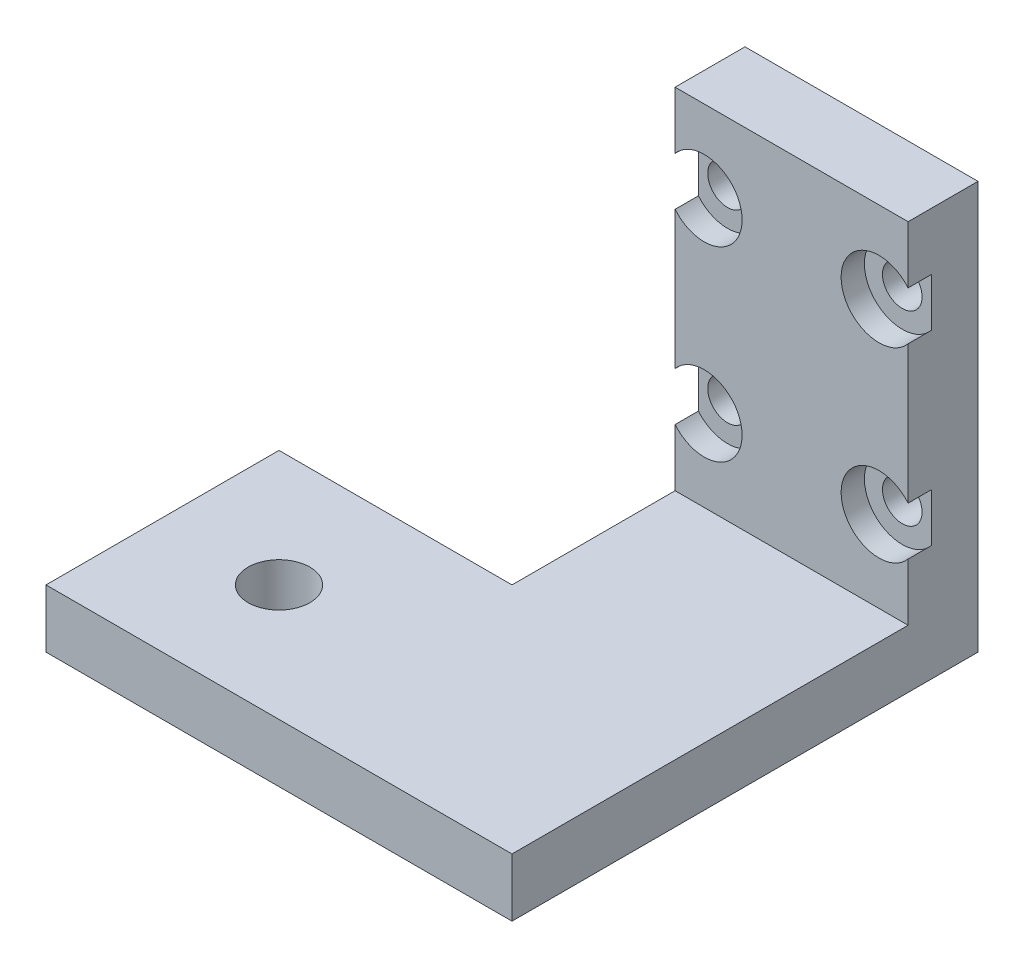
ISO-10303-21;
HEADER;
FILE_DESCRIPTION(('STEP AP214'),'2;1');
FILE_NAME('part.step','',(''),(''),'','','');
FILE_SCHEMA(('AUTOMOTIVE_DESIGN { 1 0 10303 214 1 1 1 1 }'));
ENDSEC;
DATA;
#1=APPLICATION_CONTEXT('core data for automotive mechanical design processes');
#2=APPLICATION_PROTOCOL_DEFINITION('international standard','automotive_design',2000,#1);
#3=PRODUCT_CONTEXT('',#1,'mechanical');
#4=PRODUCT('Part','Part','',(#3));
#5=PRODUCT_RELATED_PRODUCT_CATEGORY('part','',(#4));
#6=PRODUCT_DEFINITION_FORMATION('','',#4);
#7=PRODUCT_DEFINITION_CONTEXT('part definition',#1,'design');
#8=PRODUCT_DEFINITION('design','',#6,#7);
#9=PRODUCT_DEFINITION_SHAPE('','',#8);
#10=(LENGTH_UNIT() NAMED_UNIT(*) SI_UNIT(.MILLI.,.METRE.));
#11=(NAMED_UNIT(*) PLANE_ANGLE_UNIT() SI_UNIT($,.RADIAN.));
#12=(NAMED_UNIT(*) SI_UNIT($,.STERADIAN.) SOLID_ANGLE_UNIT());
#13=UNCERTAINTY_MEASURE_WITH_UNIT(LENGTH_MEASURE(1.E-05),#10,'distance_accuracy_value','');
#14=(GEOMETRIC_REPRESENTATION_CONTEXT(3) GLOBAL_UNCERTAINTY_ASSIGNED_CONTEXT((#13)) GLOBAL_UNIT_ASSIGNED_CONTEXT((#10,
#11,#12)) REPRESENTATION_CONTEXT('',''));
#15=CARTESIAN_POINT('',(0.,0.,0.));
#16=DIRECTION('',(0.,0.,1.));
#17=DIRECTION('',(1.,0.,0.));
#18=AXIS2_PLACEMENT_3D('',#15,#16,#17);
#19=CARTESIAN_POINT('',(0.,-5.,0.));
#20=DIRECTION('',(0.,1.,0.));
#21=DIRECTION('',(0.,0.,1.));
#22=AXIS2_PLACEMENT_3D('',#19,#20,#21);
#23=PLANE('',#22);
#24=DIRECTION('',(0.,0.,1.));
#25=VECTOR('',#24,1.);
#26=CARTESIAN_POINT('',(0.,-5.,0.));
#27=LINE('',#26,#25);
#28=CARTESIAN_POINT('',(0.,-5.,-20.));
#29=VERTEX_POINT('',#28);
#30=CARTESIAN_POINT('',(0.,-5.,0.));
#31=VERTEX_POINT('',#30);
#32=EDGE_CURVE('E178',#29,#31,#27,.T.);
#33=ORIENTED_EDGE('',*,*,#32,.F.);
#34=DIRECTION('',(-1.,0.,0.));
#35=VECTOR('',#34,1.);
#36=CARTESIAN_POINT('',(20.,-5.,-20.));
#37=LINE('',#36,#35);
#38=CARTESIAN_POINT('',(20.,-5.,-20.));
#39=VERTEX_POINT('',#38);
#40=EDGE_CURVE('E192',#39,#29,#37,.T.);
#41=ORIENTED_EDGE('',*,*,#40,.F.);
#42=DIRECTION('',(0.,0.,-1.));
#43=VECTOR('',#42,1.);
#44=CARTESIAN_POINT('',(20.,-5.,0.));
#45=LINE('',#44,#43);
#46=CARTESIAN_POINT('',(20.,-5.,20.));
#47=VERTEX_POINT('',#46);
#48=EDGE_CURVE('E190',#47,#39,#45,.T.);
#49=ORIENTED_EDGE('',*,*,#48,.F.);
#50=DIRECTION('',(1.,0.,0.));
#51=VECTOR('',#50,1.);
#52=CARTESIAN_POINT('',(0.,-5.,20.));
#53=LINE('',#52,#51);
#54=CARTESIAN_POINT('',(-20.,-5.,20.));
#55=VERTEX_POINT('',#54);
#56=EDGE_CURVE('E188',#55,#47,#53,.T.);
#57=ORIENTED_EDGE('',*,*,#56,.F.);
#58=DIRECTION('',(0.,0.,1.));
#59=VECTOR('',#58,1.);
#60=CARTESIAN_POINT('',(-20.,-5.,0.));
#61=LINE('',#60,#59);
#62=CARTESIAN_POINT('',(-20.,-5.,0.));
#63=VERTEX_POINT('',#62);
#64=EDGE_CURVE('E185',#63,#55,#61,.T.);
#65=ORIENTED_EDGE('',*,*,#64,.F.);
#66=DIRECTION('',(-1.,0.,0.));
#67=VECTOR('',#66,1.);
#68=CARTESIAN_POINT('',(0.,-5.,0.));
#69=LINE('',#68,#67);
#70=EDGE_CURVE('E181',#31,#63,#69,.T.);
#71=ORIENTED_EDGE('',*,*,#70,.F.);
#72=EDGE_LOOP('',(#33,#41,#49,#57,#65,#71));
#73=FACE_BOUND('',#72,.T.);
#74=CARTESIAN_POINT('',(-10.,-5.,10.));
#75=DIRECTION('',(0.,-1.,0.));
#76=DIRECTION('',(0.,0.,-1.));
#77=AXIS2_PLACEMENT_3D('',#74,#75,#76);
#78=CIRCLE('',#77,2.64999999999999);
#79=CARTESIAN_POINT('',(-10.,-5.,7.35000000000001));
#80=VERTEX_POINT('',#79);
#81=EDGE_CURVE('E303',#80,#80,#78,.T.);
#82=ORIENTED_EDGE('',*,*,#81,.F.);
#83=EDGE_LOOP('',(#82));
#84=FACE_BOUND('',#83,.T.);
#85=ADVANCED_FACE('F37',(#73,#84),#23,.F.);
#86=CARTESIAN_POINT('',(0.,0.,0.));
#87=DIRECTION('',(0.,1.,0.));
#88=DIRECTION('',(0.,0.,1.));
#89=AXIS2_PLACEMENT_3D('',#86,#87,#88);
#90=PLANE('',#89);
#91=DIRECTION('',(1.,0.,0.));
#92=VECTOR('',#91,1.);
#93=CARTESIAN_POINT('',(20.,0.,-14.));
#94=LINE('',#93,#92);
#95=CARTESIAN_POINT('',(0.,0.,-14.));
#96=VERTEX_POINT('',#95);
#97=CARTESIAN_POINT('',(20.,0.,-14.));
#98=VERTEX_POINT('',#97);
#99=EDGE_CURVE('E248',#96,#98,#94,.T.);
#100=ORIENTED_EDGE('',*,*,#99,.F.);
#101=DIRECTION('',(0.,0.,1.));
#102=VECTOR('',#101,1.);
#103=CARTESIAN_POINT('',(0.,0.,0.));
#104=LINE('',#103,#102);
#105=CARTESIAN_POINT('',(0.,0.,0.));
#106=VERTEX_POINT('',#105);
#107=EDGE_CURVE('E173',#96,#106,#104,.T.);
#108=ORIENTED_EDGE('',*,*,#107,.T.);
#109=DIRECTION('',(-1.,0.,0.));
#110=VECTOR('',#109,1.);
#111=CARTESIAN_POINT('',(0.,0.,0.));
#112=LINE('',#111,#110);
#113=CARTESIAN_POINT('',(-20.,0.,0.));
#114=VERTEX_POINT('',#113);
#115=EDGE_CURVE('E197',#106,#114,#112,.T.);
#116=ORIENTED_EDGE('',*,*,#115,.T.);
#117=DIRECTION('',(0.,0.,1.));
#118=VECTOR('',#117,1.);
#119=CARTESIAN_POINT('',(-20.,0.,0.));
#120=LINE('',#119,#118);
#121=CARTESIAN_POINT('',(-20.,0.,20.));
#122=VERTEX_POINT('',#121);
#123=EDGE_CURVE('E200',#114,#122,#120,.T.);
#124=ORIENTED_EDGE('',*,*,#123,.T.);
#125=DIRECTION('',(1.,0.,0.));
#126=VECTOR('',#125,1.);
#127=CARTESIAN_POINT('',(0.,0.,20.));
#128=LINE('',#127,#126);
#129=CARTESIAN_POINT('',(20.,0.,20.));
#130=VERTEX_POINT('',#129);
#131=EDGE_CURVE('E203',#122,#130,#128,.T.);
#132=ORIENTED_EDGE('',*,*,#131,.T.);
#133=DIRECTION('',(0.,0.,-1.));
#134=VECTOR('',#133,1.);
#135=CARTESIAN_POINT('',(20.,0.,0.));
#136=LINE('',#135,#134);
#137=EDGE_CURVE('E182',#130,#98,#136,.T.);
#138=ORIENTED_EDGE('',*,*,#137,.T.);
#139=EDGE_LOOP('',(#100,#108,#116,#124,#132,#138));
#140=FACE_BOUND('',#139,.T.);
#141=CARTESIAN_POINT('',(-10.,0.,10.));
#142=DIRECTION('',(0.,1.,0.));
#143=DIRECTION('',(0.,0.,1.));
#144=AXIS2_PLACEMENT_3D('',#141,#142,#143);
#145=CIRCLE('',#144,2.64999999999999);
#146=CARTESIAN_POINT('',(-10.,0.,12.65));
#147=VERTEX_POINT('',#146);
#148=EDGE_CURVE('E300',#147,#147,#145,.F.);
#149=ORIENTED_EDGE('',*,*,#148,.T.);
#150=EDGE_LOOP('',(#149));
#151=FACE_BOUND('',#150,.T.);
#152=ADVANCED_FACE('F246',(#140,#151),#90,.T.);
#153=CARTESIAN_POINT('',(20.,30.,-14.));
#154=DIRECTION('',(0.,0.,-1.));
#155=DIRECTION('',(-1.,0.,0.));
#156=AXIS2_PLACEMENT_3D('',#153,#154,#155);
#157=PLANE('',#156);
#158=DIRECTION('',(0.,-1.,0.));
#159=VECTOR('',#158,1.);
#160=CARTESIAN_POINT('',(0.,30.,-14.));
#161=LINE('',#160,#159);
#162=CARTESIAN_POINT('',(0.,30.,-14.));
#163=VERTEX_POINT('',#162);
#164=CARTESIAN_POINT('',(0.,25.0766559657296,-14.));
#165=VERTEX_POINT('',#164);
#166=EDGE_CURVE('E169',#163,#165,#161,.T.);
#167=ORIENTED_EDGE('',*,*,#166,.T.);
#168=CARTESIAN_POINT('',(2.49999999999995,23.,-14.));
#169=DIRECTION('',(0.,0.,1.));
#170=DIRECTION('',(1.,0.,0.));
#171=AXIS2_PLACEMENT_3D('',#168,#169,#170);
#172=CIRCLE('',#171,3.25);
#173=CARTESIAN_POINT('',(0.,20.9233440342704,-14.));
#174=VERTEX_POINT('',#173);
#175=EDGE_CURVE('E159',#174,#165,#172,.T.);
#176=ORIENTED_EDGE('',*,*,#175,.F.);
#177=CARTESIAN_POINT('',(0.,9.07665596572958,-14.));
#178=VERTEX_POINT('',#177);
#179=EDGE_CURVE('E163',#174,#178,#161,.T.);
#180=ORIENTED_EDGE('',*,*,#179,.T.);
#181=CARTESIAN_POINT('',(2.49999999999995,7.,-14.));
#182=DIRECTION('',(0.,0.,1.));
#183=DIRECTION('',(1.,0.,0.));
#184=AXIS2_PLACEMENT_3D('',#181,#182,#183);
#185=CIRCLE('',#184,3.25);
#186=CARTESIAN_POINT('',(0.,4.92334403427042,-14.));
#187=VERTEX_POINT('',#186);
#188=EDGE_CURVE('E236',#187,#178,#185,.T.);
#189=ORIENTED_EDGE('',*,*,#188,.F.);
#190=EDGE_CURVE('E170',#187,#96,#161,.T.);
#191=ORIENTED_EDGE('',*,*,#190,.T.);
#192=ORIENTED_EDGE('',*,*,#99,.T.);
#193=DIRECTION('',(0.,-1.,0.));
#194=VECTOR('',#193,1.);
#195=CARTESIAN_POINT('',(20.,30.,-14.));
#196=LINE('',#195,#194);
#197=CARTESIAN_POINT('',(20.,4.92334403427024,-14.));
#198=VERTEX_POINT('',#197);
#199=EDGE_CURVE('E260',#198,#98,#196,.T.);
#200=ORIENTED_EDGE('',*,*,#199,.F.);
#201=CARTESIAN_POINT('',(17.5000000000002,7.,-14.));
#202=DIRECTION('',(0.,0.,1.));
#203=DIRECTION('',(1.,0.,0.));
#204=AXIS2_PLACEMENT_3D('',#201,#202,#203);
#205=CIRCLE('',#204,3.25);
#206=CARTESIAN_POINT('',(20.,9.07665596572977,-14.));
#207=VERTEX_POINT('',#206);
#208=EDGE_CURVE('E286',#207,#198,#205,.T.);
#209=ORIENTED_EDGE('',*,*,#208,.F.);
#210=CARTESIAN_POINT('',(20.,20.9233440342704,-14.));
#211=VERTEX_POINT('',#210);
#212=EDGE_CURVE('E365',#211,#207,#196,.T.);
#213=ORIENTED_EDGE('',*,*,#212,.F.);
#214=CARTESIAN_POINT('',(17.5000000000001,23.,-14.));
#215=DIRECTION('',(0.,0.,1.));
#216=DIRECTION('',(1.,0.,0.));
#217=AXIS2_PLACEMENT_3D('',#214,#215,#216);
#218=CIRCLE('',#217,3.25);
#219=CARTESIAN_POINT('',(20.,25.0766559657296,-14.));
#220=VERTEX_POINT('',#219);
#221=EDGE_CURVE('E275',#220,#211,#218,.T.);
#222=ORIENTED_EDGE('',*,*,#221,.F.);
#223=CARTESIAN_POINT('',(20.,30.,-14.));
#224=VERTEX_POINT('',#223);
#225=EDGE_CURVE('E174',#224,#220,#196,.T.);
#226=ORIENTED_EDGE('',*,*,#225,.F.);
#227=DIRECTION('',(1.,0.,0.));
#228=VECTOR('',#227,1.);
#229=CARTESIAN_POINT('',(20.,30.,-14.));
#230=LINE('',#229,#228);
#231=EDGE_CURVE('E258',#163,#224,#230,.T.);
#232=ORIENTED_EDGE('',*,*,#231,.F.);
#233=EDGE_LOOP('',(#167,#176,#180,#189,#191,#192,#200,#209,#213,#222,#226,#232));
#234=FACE_BOUND('',#233,.T.);
#235=ADVANCED_FACE('F238',(#234),#157,.F.);
#236=CARTESIAN_POINT('',(20.,-5.,-20.));
#237=DIRECTION('',(0.,0.,-1.));
#238=DIRECTION('',(-1.,0.,0.));
#239=AXIS2_PLACEMENT_3D('',#236,#237,#238);
#240=PLANE('',#239);
#241=CARTESIAN_POINT('',(2.49999999999995,23.,-20.));
#242=DIRECTION('',(0.,0.,1.));
#243=DIRECTION('',(1.,0.,0.));
#244=AXIS2_PLACEMENT_3D('',#241,#242,#243);
#245=CIRCLE('',#244,1.7);
#246=CARTESIAN_POINT('',(4.19999999999995,23.,-20.));
#247=VERTEX_POINT('',#246);
#248=EDGE_CURVE('E241',#247,#247,#245,.T.);
#249=ORIENTED_EDGE('',*,*,#248,.T.);
#250=EDGE_LOOP('',(#249));
#251=FACE_BOUND('',#250,.T.);
#252=DIRECTION('',(0.,1.,0.));
#253=VECTOR('',#252,1.);
#254=CARTESIAN_POINT('',(0.,-5.,-20.));
#255=LINE('',#254,#253);
#256=CARTESIAN_POINT('',(0.,30.,-20.));
#257=VERTEX_POINT('',#256);
#258=EDGE_CURVE('E208',#29,#257,#255,.T.);
#259=ORIENTED_EDGE('',*,*,#258,.T.);
#260=DIRECTION('',(-1.,0.,0.));
#261=VECTOR('',#260,1.);
#262=CARTESIAN_POINT('',(20.,30.,-20.));
#263=LINE('',#262,#261);
#264=CARTESIAN_POINT('',(20.,30.,-20.));
#265=VERTEX_POINT('',#264);
#266=EDGE_CURVE('E253',#265,#257,#263,.T.);
#267=ORIENTED_EDGE('',*,*,#266,.F.);
#268=DIRECTION('',(0.,1.,0.));
#269=VECTOR('',#268,1.);
#270=CARTESIAN_POINT('',(20.,-5.,-20.));
#271=LINE('',#270,#269);
#272=EDGE_CURVE('E211',#39,#265,#271,.T.);
#273=ORIENTED_EDGE('',*,*,#272,.F.);
#274=ORIENTED_EDGE('',*,*,#40,.T.);
#275=EDGE_LOOP('',(#259,#267,#273,#274));
#276=FACE_BOUND('',#275,.T.);
#277=CARTESIAN_POINT('',(17.5000000000001,23.,-20.));
#278=DIRECTION('',(0.,0.,1.));
#279=DIRECTION('',(1.,0.,0.));
#280=AXIS2_PLACEMENT_3D('',#277,#278,#279);
#281=CIRCLE('',#280,1.7);
#282=CARTESIAN_POINT('',(19.2000000000001,23.,-20.));
#283=VERTEX_POINT('',#282);
#284=EDGE_CURVE('E266',#283,#283,#281,.T.);
#285=ORIENTED_EDGE('',*,*,#284,.T.);
#286=EDGE_LOOP('',(#285));
#287=FACE_BOUND('',#286,.T.);
#288=CARTESIAN_POINT('',(17.5000000000002,7.,-20.));
#289=DIRECTION('',(0.,0.,1.));
#290=DIRECTION('',(1.,0.,0.));
#291=AXIS2_PLACEMENT_3D('',#288,#289,#290);
#292=CIRCLE('',#291,1.7);
#293=CARTESIAN_POINT('',(19.2000000000002,7.,-20.));
#294=VERTEX_POINT('',#293);
#295=EDGE_CURVE('E277',#294,#294,#292,.T.);
#296=ORIENTED_EDGE('',*,*,#295,.T.);
#297=EDGE_LOOP('',(#296));
#298=FACE_BOUND('',#297,.T.);
#299=CARTESIAN_POINT('',(2.49999999999995,7.,-20.));
#300=DIRECTION('',(0.,0.,1.));
#301=DIRECTION('',(1.,0.,0.));
#302=AXIS2_PLACEMENT_3D('',#299,#300,#301);
#303=CIRCLE('',#302,1.7);
#304=CARTESIAN_POINT('',(4.19999999999995,7.,-20.));
#305=VERTEX_POINT('',#304);
#306=EDGE_CURVE('E288',#305,#305,#303,.T.);
#307=ORIENTED_EDGE('',*,*,#306,.T.);
#308=EDGE_LOOP('',(#307));
#309=FACE_BOUND('',#308,.T.);
#310=ADVANCED_FACE('F320',(#251,#276,#287,#298,#309),#240,.T.);
#311=CARTESIAN_POINT('',(0.,-5.,0.));
#312=DIRECTION('',(-1.,0.,0.));
#313=DIRECTION('',(0.,0.,1.));
#314=AXIS2_PLACEMENT_3D('',#311,#312,#313);
#315=PLANE('',#314);
#316=DIRECTION('',(0.,0.,1.));
#317=VECTOR('',#316,1.);
#318=CARTESIAN_POINT('',(0.,20.9233440342704,-14.));
#319=LINE('',#318,#317);
#320=CARTESIAN_POINT('',(0.,20.9233440342704,-16.));
#321=VERTEX_POINT('',#320);
#322=EDGE_CURVE('E11',#321,#174,#319,.T.);
#323=ORIENTED_EDGE('',*,*,#322,.F.);
#324=DIRECTION('',(0.,-1.,0.));
#325=VECTOR('',#324,1.);
#326=CARTESIAN_POINT('',(0.,-5.,-16.));
#327=LINE('',#326,#325);
#328=CARTESIAN_POINT('',(0.,25.0766559657296,-16.));
#329=VERTEX_POINT('',#328);
#330=EDGE_CURVE('E147',#329,#321,#327,.T.);
#331=ORIENTED_EDGE('',*,*,#330,.F.);
#332=DIRECTION('',(0.,0.,1.));
#333=VECTOR('',#332,1.);
#334=CARTESIAN_POINT('',(0.,25.0766559657296,-14.));
#335=LINE('',#334,#333);
#336=EDGE_CURVE('E45',#165,#329,#335,.F.);
#337=ORIENTED_EDGE('',*,*,#336,.F.);
#338=ORIENTED_EDGE('',*,*,#166,.F.);
#339=DIRECTION('',(0.,0.,1.));
#340=VECTOR('',#339,1.);
#341=CARTESIAN_POINT('',(0.,30.,-20.));
#342=LINE('',#341,#340);
#343=EDGE_CURVE('E261',#257,#163,#342,.T.);
#344=ORIENTED_EDGE('',*,*,#343,.F.);
#345=ORIENTED_EDGE('',*,*,#258,.F.);
#346=ORIENTED_EDGE('',*,*,#32,.T.);
#347=DIRECTION('',(0.,1.,0.));
#348=VECTOR('',#347,1.);
#349=CARTESIAN_POINT('',(0.,-5.,0.));
#350=LINE('',#349,#348);
#351=EDGE_CURVE('E195',#31,#106,#350,.T.);
#352=ORIENTED_EDGE('',*,*,#351,.T.);
#353=ORIENTED_EDGE('',*,*,#107,.F.);
#354=ORIENTED_EDGE('',*,*,#190,.F.);
#355=DIRECTION('',(0.,0.,1.));
#356=VECTOR('',#355,1.);
#357=CARTESIAN_POINT('',(0.,4.92334403427042,-14.));
#358=LINE('',#357,#356);
#359=CARTESIAN_POINT('',(0.,4.92334403427042,-16.));
#360=VERTEX_POINT('',#359);
#361=EDGE_CURVE('E153',#360,#187,#358,.T.);
#362=ORIENTED_EDGE('',*,*,#361,.F.);
#363=DIRECTION('',(0.,-1.,0.));
#364=VECTOR('',#363,1.);
#365=CARTESIAN_POINT('',(0.,-5.,-16.));
#366=LINE('',#365,#364);
#367=CARTESIAN_POINT('',(0.,9.07665596572958,-16.));
#368=VERTEX_POINT('',#367);
#369=EDGE_CURVE('E230',#368,#360,#366,.T.);
#370=ORIENTED_EDGE('',*,*,#369,.F.);
#371=DIRECTION('',(0.,0.,1.));
#372=VECTOR('',#371,1.);
#373=CARTESIAN_POINT('',(0.,9.07665596572958,-14.));
#374=LINE('',#373,#372);
#375=EDGE_CURVE('E165',#178,#368,#374,.F.);
#376=ORIENTED_EDGE('',*,*,#375,.F.);
#377=ORIENTED_EDGE('',*,*,#179,.F.);
#378=EDGE_LOOP('',(#323,#331,#337,#338,#344,#345,#346,#352,#353,#354,#362,#370,#376,#377));
#379=FACE_BOUND('',#378,.T.);
#380=ADVANCED_FACE('F39',(#379),#315,.T.);
#381=CARTESIAN_POINT('',(20.,-5.,0.));
#382=DIRECTION('',(1.,0.,0.));
#383=DIRECTION('',(0.,0.,-1.));
#384=AXIS2_PLACEMENT_3D('',#381,#382,#383);
#385=PLANE('',#384);
#386=DIRECTION('',(0.,0.,1.));
#387=VECTOR('',#386,1.);
#388=CARTESIAN_POINT('',(20.,9.07665596572977,-14.));
#389=LINE('',#388,#387);
#390=CARTESIAN_POINT('',(20.,9.07665596572977,-16.));
#391=VERTEX_POINT('',#390);
#392=EDGE_CURVE('E228',#391,#207,#389,.T.);
#393=ORIENTED_EDGE('',*,*,#392,.F.);
#394=DIRECTION('',(0.,1.,0.));
#395=VECTOR('',#394,1.);
#396=CARTESIAN_POINT('',(20.,-5.,-16.));
#397=LINE('',#396,#395);
#398=CARTESIAN_POINT('',(20.,4.92334403427023,-16.));
#399=VERTEX_POINT('',#398);
#400=EDGE_CURVE('E226',#399,#391,#397,.T.);
#401=ORIENTED_EDGE('',*,*,#400,.F.);
#402=DIRECTION('',(0.,0.,1.));
#403=VECTOR('',#402,1.);
#404=CARTESIAN_POINT('',(20.,4.92334403427023,-14.));
#405=LINE('',#404,#403);
#406=EDGE_CURVE('E224',#198,#399,#405,.F.);
#407=ORIENTED_EDGE('',*,*,#406,.F.);
#408=ORIENTED_EDGE('',*,*,#199,.T.);
#409=ORIENTED_EDGE('',*,*,#137,.F.);
#410=DIRECTION('',(0.,1.,0.));
#411=VECTOR('',#410,1.);
#412=CARTESIAN_POINT('',(20.,-5.,20.));
#413=LINE('',#412,#411);
#414=EDGE_CURVE('E213',#47,#130,#413,.T.);
#415=ORIENTED_EDGE('',*,*,#414,.F.);
#416=ORIENTED_EDGE('',*,*,#48,.T.);
#417=ORIENTED_EDGE('',*,*,#272,.T.);
#418=DIRECTION('',(0.,0.,-1.));
#419=VECTOR('',#418,1.);
#420=CARTESIAN_POINT('',(20.,30.,-20.));
#421=LINE('',#420,#419);
#422=EDGE_CURVE('E250',#224,#265,#421,.T.);
#423=ORIENTED_EDGE('',*,*,#422,.F.);
#424=ORIENTED_EDGE('',*,*,#225,.T.);
#425=DIRECTION('',(0.,0.,1.));
#426=VECTOR('',#425,1.);
#427=CARTESIAN_POINT('',(20.,25.0766559657296,-14.));
#428=LINE('',#427,#426);
#429=CARTESIAN_POINT('',(20.,25.0766559657296,-16.));
#430=VERTEX_POINT('',#429);
#431=EDGE_CURVE('E251',#430,#220,#428,.T.);
#432=ORIENTED_EDGE('',*,*,#431,.F.);
#433=DIRECTION('',(0.,1.,0.));
#434=VECTOR('',#433,1.);
#435=CARTESIAN_POINT('',(20.,-5.,-16.));
#436=LINE('',#435,#434);
#437=CARTESIAN_POINT('',(20.,20.9233440342704,-16.));
#438=VERTEX_POINT('',#437);
#439=EDGE_CURVE('E210',#438,#430,#436,.T.);
#440=ORIENTED_EDGE('',*,*,#439,.F.);
#441=DIRECTION('',(0.,0.,1.));
#442=VECTOR('',#441,1.);
#443=CARTESIAN_POINT('',(20.,20.9233440342704,-14.));
#444=LINE('',#443,#442);
#445=EDGE_CURVE('E255',#211,#438,#444,.F.);
#446=ORIENTED_EDGE('',*,*,#445,.F.);
#447=ORIENTED_EDGE('',*,*,#212,.T.);
#448=EDGE_LOOP('',(#393,#401,#407,#408,#409,#415,#416,#417,#423,#424,#432,#440,#446,#447));
#449=FACE_BOUND('',#448,.T.);
#450=ADVANCED_FACE('F324',(#449),#385,.T.);
#451=CARTESIAN_POINT('',(0.,-5.,20.));
#452=DIRECTION('',(0.,0.,1.));
#453=DIRECTION('',(1.,0.,0.));
#454=AXIS2_PLACEMENT_3D('',#451,#452,#453);
#455=PLANE('',#454);
#456=ORIENTED_EDGE('',*,*,#131,.F.);
#457=DIRECTION('',(0.,1.,0.));
#458=VECTOR('',#457,1.);
#459=CARTESIAN_POINT('',(-20.,-5.,20.));
#460=LINE('',#459,#458);
#461=EDGE_CURVE('E216',#55,#122,#460,.T.);
#462=ORIENTED_EDGE('',*,*,#461,.F.);
#463=ORIENTED_EDGE('',*,*,#56,.T.);
#464=ORIENTED_EDGE('',*,*,#414,.T.);
#465=EDGE_LOOP('',(#456,#462,#463,#464));
#466=FACE_BOUND('',#465,.T.);
#467=ADVANCED_FACE('F327',(#466),#455,.T.);
#468=CARTESIAN_POINT('',(-20.,-5.,0.));
#469=DIRECTION('',(-1.,0.,0.));
#470=DIRECTION('',(0.,0.,1.));
#471=AXIS2_PLACEMENT_3D('',#468,#469,#470);
#472=PLANE('',#471);
#473=ORIENTED_EDGE('',*,*,#123,.F.);
#474=DIRECTION('',(0.,1.,0.));
#475=VECTOR('',#474,1.);
#476=CARTESIAN_POINT('',(-20.,-5.,0.));
#477=LINE('',#476,#475);
#478=EDGE_CURVE('E219',#63,#114,#477,.T.);
#479=ORIENTED_EDGE('',*,*,#478,.F.);
#480=ORIENTED_EDGE('',*,*,#64,.T.);
#481=ORIENTED_EDGE('',*,*,#461,.T.);
#482=EDGE_LOOP('',(#473,#479,#480,#481));
#483=FACE_BOUND('',#482,.T.);
#484=ADVANCED_FACE('F331',(#483),#472,.T.);
#485=CARTESIAN_POINT('',(0.,-5.,0.));
#486=DIRECTION('',(0.,0.,-1.));
#487=DIRECTION('',(-1.,0.,0.));
#488=AXIS2_PLACEMENT_3D('',#485,#486,#487);
#489=PLANE('',#488);
#490=ORIENTED_EDGE('',*,*,#115,.F.);
#491=ORIENTED_EDGE('',*,*,#351,.F.);
#492=ORIENTED_EDGE('',*,*,#70,.T.);
#493=ORIENTED_EDGE('',*,*,#478,.T.);
#494=EDGE_LOOP('',(#490,#491,#492,#493));
#495=FACE_BOUND('',#494,.T.);
#496=ADVANCED_FACE('F334',(#495),#489,.T.);
#497=CARTESIAN_POINT('',(0.,30.,0.));
#498=DIRECTION('',(0.,-1.,0.));
#499=DIRECTION('',(0.,0.,-1.));
#500=AXIS2_PLACEMENT_3D('',#497,#498,#499);
#501=PLANE('',#500);
#502=ORIENTED_EDGE('',*,*,#422,.T.);
#503=ORIENTED_EDGE('',*,*,#266,.T.);
#504=ORIENTED_EDGE('',*,*,#343,.T.);
#505=ORIENTED_EDGE('',*,*,#231,.T.);
#506=EDGE_LOOP('',(#502,#503,#504,#505));
#507=FACE_BOUND('',#506,.T.);
#508=ADVANCED_FACE('F337',(#507),#501,.F.);
#509=CARTESIAN_POINT('',(17.5000000000001,23.,-14.));
#510=DIRECTION('',(0.,0.,1.));
#511=DIRECTION('',(1.,0.,0.));
#512=AXIS2_PLACEMENT_3D('',#509,#510,#511);
#513=CYLINDRICAL_SURFACE('',#512,1.7);
#514=ORIENTED_EDGE('',*,*,#284,.F.);
#515=EDGE_LOOP('',(#514));
#516=FACE_BOUND('',#515,.T.);
#517=CARTESIAN_POINT('',(17.5000000000001,23.,-16.));
#518=DIRECTION('',(0.,0.,1.));
#519=DIRECTION('',(1.,0.,0.));
#520=AXIS2_PLACEMENT_3D('',#517,#518,#519);
#521=CIRCLE('',#520,1.7);
#522=CARTESIAN_POINT('',(19.2000000000001,23.,-16.));
#523=VERTEX_POINT('',#522);
#524=EDGE_CURVE('E269',#523,#523,#521,.T.);
#525=ORIENTED_EDGE('',*,*,#524,.T.);
#526=EDGE_LOOP('',(#525));
#527=FACE_BOUND('',#526,.T.);
#528=ADVANCED_FACE('F342',(#516,#527),#513,.F.);
#529=CARTESIAN_POINT('',(19.2000000000001,23.,-16.));
#530=DIRECTION('',(0.,0.,-1.));
#531=DIRECTION('',(-1.,0.,0.));
#532=AXIS2_PLACEMENT_3D('',#529,#530,#531);
#533=PLANE('',#532);
#534=ORIENTED_EDGE('',*,*,#439,.T.);
#535=CARTESIAN_POINT('',(17.5000000000001,23.,-16.));
#536=DIRECTION('',(0.,0.,1.));
#537=DIRECTION('',(1.,0.,0.));
#538=AXIS2_PLACEMENT_3D('',#535,#536,#537);
#539=CIRCLE('',#538,3.25);
#540=EDGE_CURVE('E272',#430,#438,#539,.T.);
#541=ORIENTED_EDGE('',*,*,#540,.T.);
#542=EDGE_LOOP('',(#534,#541));
#543=FACE_BOUND('',#542,.T.);
#544=ORIENTED_EDGE('',*,*,#524,.F.);
#545=EDGE_LOOP('',(#544));
#546=FACE_BOUND('',#545,.T.);
#547=ADVANCED_FACE('F377',(#543,#546),#533,.F.);
#548=CARTESIAN_POINT('',(17.5000000000001,23.,-14.));
#549=DIRECTION('',(0.,0.,1.));
#550=DIRECTION('',(1.,0.,0.));
#551=AXIS2_PLACEMENT_3D('',#548,#549,#550);
#552=CYLINDRICAL_SURFACE('',#551,3.25);
#553=ORIENTED_EDGE('',*,*,#431,.T.);
#554=ORIENTED_EDGE('',*,*,#221,.T.);
#555=ORIENTED_EDGE('',*,*,#445,.T.);
#556=ORIENTED_EDGE('',*,*,#540,.F.);
#557=EDGE_LOOP('',(#553,#554,#555,#556));
#558=FACE_BOUND('',#557,.T.);
#559=ADVANCED_FACE('F375',(#558),#552,.F.);
#560=CARTESIAN_POINT('',(17.5000000000002,7.,-14.));
#561=DIRECTION('',(0.,0.,1.));
#562=DIRECTION('',(1.,0.,0.));
#563=AXIS2_PLACEMENT_3D('',#560,#561,#562);
#564=CYLINDRICAL_SURFACE('',#563,1.7);
#565=ORIENTED_EDGE('',*,*,#295,.F.);
#566=EDGE_LOOP('',(#565));
#567=FACE_BOUND('',#566,.T.);
#568=CARTESIAN_POINT('',(17.5000000000002,7.,-16.));
#569=DIRECTION('',(0.,0.,1.));
#570=DIRECTION('',(1.,0.,0.));
#571=AXIS2_PLACEMENT_3D('',#568,#569,#570);
#572=CIRCLE('',#571,1.7);
#573=CARTESIAN_POINT('',(19.2000000000002,7.,-16.));
#574=VERTEX_POINT('',#573);
#575=EDGE_CURVE('E280',#574,#574,#572,.T.);
#576=ORIENTED_EDGE('',*,*,#575,.T.);
#577=EDGE_LOOP('',(#576));
#578=FACE_BOUND('',#577,.T.);
#579=ADVANCED_FACE('F392',(#567,#578),#564,.F.);
#580=CARTESIAN_POINT('',(19.2000000000002,7.,-16.));
#581=DIRECTION('',(0.,0.,-1.));
#582=DIRECTION('',(-1.,0.,0.));
#583=AXIS2_PLACEMENT_3D('',#580,#581,#582);
#584=PLANE('',#583);
#585=ORIENTED_EDGE('',*,*,#400,.T.);
#586=CARTESIAN_POINT('',(17.5000000000002,7.,-16.));
#587=DIRECTION('',(0.,0.,1.));
#588=DIRECTION('',(1.,0.,0.));
#589=AXIS2_PLACEMENT_3D('',#586,#587,#588);
#590=CIRCLE('',#589,3.25);
#591=EDGE_CURVE('E283',#391,#399,#590,.T.);
#592=ORIENTED_EDGE('',*,*,#591,.T.);
#593=EDGE_LOOP('',(#585,#592));
#594=FACE_BOUND('',#593,.T.);
#595=ORIENTED_EDGE('',*,*,#575,.F.);
#596=EDGE_LOOP('',(#595));
#597=FACE_BOUND('',#596,.T.);
#598=ADVANCED_FACE('F395',(#594,#597),#584,.F.);
#599=CARTESIAN_POINT('',(17.5000000000002,7.,-14.));
#600=DIRECTION('',(0.,0.,1.));
#601=DIRECTION('',(1.,0.,0.));
#602=AXIS2_PLACEMENT_3D('',#599,#600,#601);
#603=CYLINDRICAL_SURFACE('',#602,3.25);
#604=ORIENTED_EDGE('',*,*,#392,.T.);
#605=ORIENTED_EDGE('',*,*,#208,.T.);
#606=ORIENTED_EDGE('',*,*,#406,.T.);
#607=ORIENTED_EDGE('',*,*,#591,.F.);
#608=EDGE_LOOP('',(#604,#605,#606,#607));
#609=FACE_BOUND('',#608,.T.);
#610=ADVANCED_FACE('F399',(#609),#603,.F.);
#611=CARTESIAN_POINT('',(2.49999999999995,7.,-14.));
#612=DIRECTION('',(0.,0.,1.));
#613=DIRECTION('',(1.,0.,0.));
#614=AXIS2_PLACEMENT_3D('',#611,#612,#613);
#615=CYLINDRICAL_SURFACE('',#614,1.7);
#616=ORIENTED_EDGE('',*,*,#306,.F.);
#617=EDGE_LOOP('',(#616));
#618=FACE_BOUND('',#617,.T.);
#619=CARTESIAN_POINT('',(2.49999999999995,7.,-16.));
#620=DIRECTION('',(0.,0.,1.));
#621=DIRECTION('',(1.,0.,0.));
#622=AXIS2_PLACEMENT_3D('',#619,#620,#621);
#623=CIRCLE('',#622,1.7);
#624=CARTESIAN_POINT('',(4.19999999999995,7.,-16.));
#625=VERTEX_POINT('',#624);
#626=EDGE_CURVE('E291',#625,#625,#623,.T.);
#627=ORIENTED_EDGE('',*,*,#626,.T.);
#628=EDGE_LOOP('',(#627));
#629=FACE_BOUND('',#628,.T.);
#630=ADVANCED_FACE('F403',(#618,#629),#615,.F.);
#631=CARTESIAN_POINT('',(4.19999999999995,7.,-16.));
#632=DIRECTION('',(0.,0.,-1.));
#633=DIRECTION('',(-1.,0.,0.));
#634=AXIS2_PLACEMENT_3D('',#631,#632,#633);
#635=PLANE('',#634);
#636=ORIENTED_EDGE('',*,*,#369,.T.);
#637=CARTESIAN_POINT('',(2.49999999999995,7.,-16.));
#638=DIRECTION('',(0.,0.,1.));
#639=DIRECTION('',(1.,0.,0.));
#640=AXIS2_PLACEMENT_3D('',#637,#638,#639);
#641=CIRCLE('',#640,3.25);
#642=EDGE_CURVE('E58',#360,#368,#641,.T.);
#643=ORIENTED_EDGE('',*,*,#642,.T.);
#644=EDGE_LOOP('',(#636,#643));
#645=FACE_BOUND('',#644,.T.);
#646=ORIENTED_EDGE('',*,*,#626,.F.);
#647=EDGE_LOOP('',(#646));
#648=FACE_BOUND('',#647,.T.);
#649=ADVANCED_FACE('F406',(#645,#648),#635,.F.);
#650=CARTESIAN_POINT('',(2.49999999999995,7.,-14.));
#651=DIRECTION('',(0.,0.,1.));
#652=DIRECTION('',(1.,0.,0.));
#653=AXIS2_PLACEMENT_3D('',#650,#651,#652);
#654=CYLINDRICAL_SURFACE('',#653,3.25);
#655=ORIENTED_EDGE('',*,*,#361,.T.);
#656=ORIENTED_EDGE('',*,*,#188,.T.);
#657=ORIENTED_EDGE('',*,*,#375,.T.);
#658=ORIENTED_EDGE('',*,*,#642,.F.);
#659=EDGE_LOOP('',(#655,#656,#657,#658));
#660=FACE_BOUND('',#659,.T.);
#661=ADVANCED_FACE('F235',(#660),#654,.F.);
#662=CARTESIAN_POINT('',(2.49999999999995,23.,-14.));
#663=DIRECTION('',(0.,0.,1.));
#664=DIRECTION('',(1.,0.,0.));
#665=AXIS2_PLACEMENT_3D('',#662,#663,#664);
#666=CYLINDRICAL_SURFACE('',#665,1.7);
#667=ORIENTED_EDGE('',*,*,#248,.F.);
#668=EDGE_LOOP('',(#667));
#669=FACE_BOUND('',#668,.T.);
#670=CARTESIAN_POINT('',(2.49999999999995,23.,-16.));
#671=DIRECTION('',(0.,0.,1.));
#672=DIRECTION('',(1.,0.,0.));
#673=AXIS2_PLACEMENT_3D('',#670,#671,#672);
#674=CIRCLE('',#673,1.7);
#675=CARTESIAN_POINT('',(4.19999999999995,23.,-16.));
#676=VERTEX_POINT('',#675);
#677=EDGE_CURVE('E158',#676,#676,#674,.T.);
#678=ORIENTED_EDGE('',*,*,#677,.T.);
#679=EDGE_LOOP('',(#678));
#680=FACE_BOUND('',#679,.T.);
#681=ADVANCED_FACE('F412',(#669,#680),#666,.F.);
#682=CARTESIAN_POINT('',(4.19999999999995,23.,-16.));
#683=DIRECTION('',(0.,0.,-1.));
#684=DIRECTION('',(-1.,0.,0.));
#685=AXIS2_PLACEMENT_3D('',#682,#683,#684);
#686=PLANE('',#685);
#687=ORIENTED_EDGE('',*,*,#330,.T.);
#688=CARTESIAN_POINT('',(2.49999999999995,23.,-16.));
#689=DIRECTION('',(0.,0.,1.));
#690=DIRECTION('',(1.,0.,0.));
#691=AXIS2_PLACEMENT_3D('',#688,#689,#690);
#692=CIRCLE('',#691,3.25);
#693=EDGE_CURVE('E51',#321,#329,#692,.T.);
#694=ORIENTED_EDGE('',*,*,#693,.T.);
#695=EDGE_LOOP('',(#687,#694));
#696=FACE_BOUND('',#695,.T.);
#697=ORIENTED_EDGE('',*,*,#677,.F.);
#698=EDGE_LOOP('',(#697));
#699=FACE_BOUND('',#698,.T.);
#700=ADVANCED_FACE('F148',(#696,#699),#686,.F.);
#701=CARTESIAN_POINT('',(2.49999999999995,23.,-14.));
#702=DIRECTION('',(0.,0.,1.));
#703=DIRECTION('',(1.,0.,0.));
#704=AXIS2_PLACEMENT_3D('',#701,#702,#703);
#705=CYLINDRICAL_SURFACE('',#704,3.25);
#706=ORIENTED_EDGE('',*,*,#322,.T.);
#707=ORIENTED_EDGE('',*,*,#175,.T.);
#708=ORIENTED_EDGE('',*,*,#336,.T.);
#709=ORIENTED_EDGE('',*,*,#693,.F.);
#710=EDGE_LOOP('',(#706,#707,#708,#709));
#711=FACE_BOUND('',#710,.T.);
#712=ADVANCED_FACE('F156',(#711),#705,.F.);
#713=CARTESIAN_POINT('',(-10.,-5.,10.));
#714=DIRECTION('',(0.,-1.,0.));
#715=DIRECTION('',(0.,0.,-1.));
#716=AXIS2_PLACEMENT_3D('',#713,#714,#715);
#717=CYLINDRICAL_SURFACE('',#716,2.64999999999999);
#718=ORIENTED_EDGE('',*,*,#148,.F.);
#719=EDGE_LOOP('',(#718));
#720=FACE_BOUND('',#719,.T.);
#721=ORIENTED_EDGE('',*,*,#81,.T.);
#722=EDGE_LOOP('',(#721));
#723=FACE_BOUND('',#722,.T.);
#724=ADVANCED_FACE('F307',(#720,#723),#717,.F.);
#725=CLOSED_SHELL('',(#85,#152,#235,#310,#380,#450,#467,#484,#496,#508,#528,#547,#559,#579,#598,
#610,#630,#649,#661,#681,#700,#712,#724));
#726=MANIFOLD_SOLID_BREP('B2',#725);
#727=ADVANCED_BREP_SHAPE_REPRESENTATION('',(#18,#726),#14);
#728=SHAPE_DEFINITION_REPRESENTATION(#9,#727);
ENDSEC;
END-ISO-10303-21;
